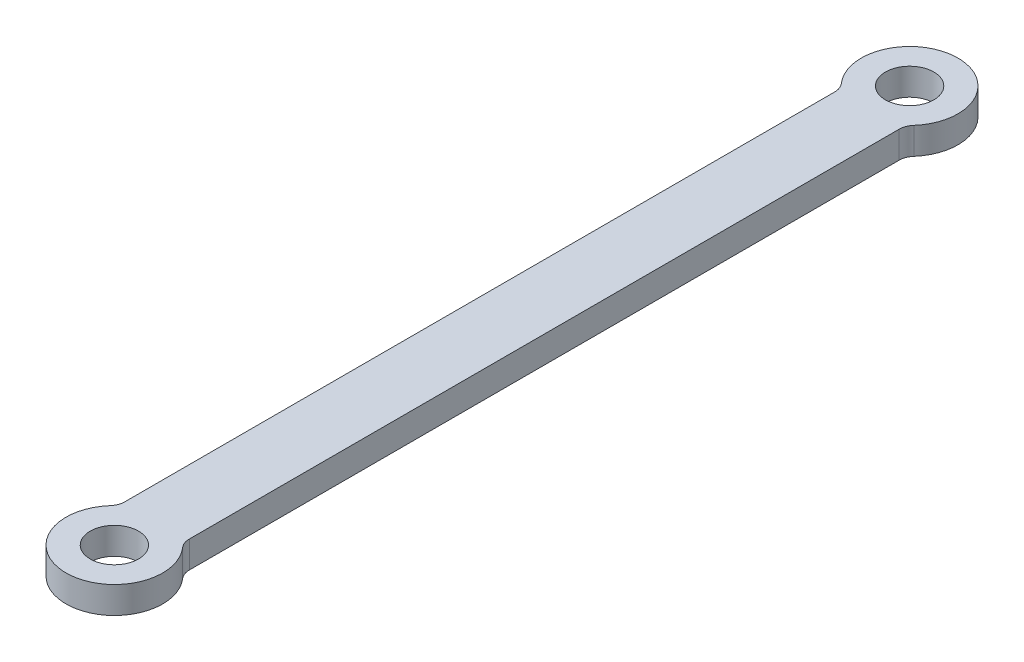
ISO-10303-21;
HEADER;
FILE_DESCRIPTION(('STEP AP214'),'2;1');
FILE_NAME('part.step','',(''),(''),'','','');
FILE_SCHEMA(('AUTOMOTIVE_DESIGN { 1 0 10303 214 1 1 1 1 }'));
ENDSEC;
DATA;
#1=APPLICATION_CONTEXT('core data for automotive mechanical design processes');
#2=APPLICATION_PROTOCOL_DEFINITION('international standard','automotive_design',2000,#1);
#3=PRODUCT_CONTEXT('',#1,'mechanical');
#4=PRODUCT('Part','Part','',(#3));
#5=PRODUCT_RELATED_PRODUCT_CATEGORY('part','',(#4));
#6=PRODUCT_DEFINITION_FORMATION('','',#4);
#7=PRODUCT_DEFINITION_CONTEXT('part definition',#1,'design');
#8=PRODUCT_DEFINITION('design','',#6,#7);
#9=PRODUCT_DEFINITION_SHAPE('','',#8);
#10=(LENGTH_UNIT() NAMED_UNIT(*) SI_UNIT(.MILLI.,.METRE.));
#11=(NAMED_UNIT(*) PLANE_ANGLE_UNIT() SI_UNIT($,.RADIAN.));
#12=(NAMED_UNIT(*) SI_UNIT($,.STERADIAN.) SOLID_ANGLE_UNIT());
#13=UNCERTAINTY_MEASURE_WITH_UNIT(LENGTH_MEASURE(1.E-05),#10,'distance_accuracy_value','');
#14=(GEOMETRIC_REPRESENTATION_CONTEXT(3) GLOBAL_UNCERTAINTY_ASSIGNED_CONTEXT((#13)) GLOBAL_UNIT_ASSIGNED_CONTEXT((#10,
#11,#12)) REPRESENTATION_CONTEXT('',''));
#15=CARTESIAN_POINT('',(0.,0.,0.));
#16=DIRECTION('',(0.,0.,1.));
#17=DIRECTION('',(1.,0.,0.));
#18=AXIS2_PLACEMENT_3D('',#15,#16,#17);
#19=CARTESIAN_POINT('',(-88.4308943089431,5.,-43.5017704570502));
#20=DIRECTION('',(0.,1.,0.));
#21=DIRECTION('',(0.,0.,1.));
#22=AXIS2_PLACEMENT_3D('',#19,#20,#21);
#23=PLANE('',#22);
#24=CARTESIAN_POINT('',(-79.4308943089431,5.,-51.4390243902439));
#25=DIRECTION('',(0.,1.,0.));
#26=DIRECTION('',(0.,0.,1.));
#27=AXIS2_PLACEMENT_3D('',#24,#25,#26);
#28=CIRCLE('',#27,4.50000000000001);
#29=CARTESIAN_POINT('',(-79.4308943089431,5.,-46.9390243902439));
#30=VERTEX_POINT('',#29);
#31=EDGE_CURVE('E146',#30,#30,#28,.T.);
#32=ORIENTED_EDGE('',*,*,#31,.F.);
#33=EDGE_LOOP('',(#32));
#34=FACE_BOUND('',#33,.T.);
#35=CARTESIAN_POINT('',(-88.4308943089431,5.,-43.5017704570502));
#36=DIRECTION('',(0.,-1.,0.));
#37=DIRECTION('',(0.,0.,1.));
#38=AXIS2_PLACEMENT_3D('',#35,#36,#37);
#39=CIRCLE('',#38,3.);
#40=CARTESIAN_POINT('',(-86.1808943089431,5.,-45.4860839403486));
#41=VERTEX_POINT('',#40);
#42=CARTESIAN_POINT('',(-85.4308943089431,5.,-43.5017704570502));
#43=VERTEX_POINT('',#42);
#44=EDGE_CURVE('E164',#41,#43,#39,.T.);
#45=ORIENTED_EDGE('',*,*,#44,.T.);
#46=DIRECTION('',(0.,0.,1.));
#47=VECTOR('',#46,1.);
#48=CARTESIAN_POINT('',(-85.4308943089431,5.,-43.5017704570502));
#49=LINE('',#48,#47);
#50=CARTESIAN_POINT('',(-85.4308943089431,5.,88.6237216765623));
#51=VERTEX_POINT('',#50);
#52=EDGE_CURVE('E100',#43,#51,#49,.T.);
#53=ORIENTED_EDGE('',*,*,#52,.T.);
#54=CARTESIAN_POINT('',(-88.4308943089431,5.,88.6237216765623));
#55=DIRECTION('',(0.,-1.,0.));
#56=DIRECTION('',(0.,0.,-1.));
#57=AXIS2_PLACEMENT_3D('',#54,#55,#56);
#58=CIRCLE('',#57,3.);
#59=CARTESIAN_POINT('',(-86.1808943089431,5.,90.6080351598608));
#60=VERTEX_POINT('',#59);
#61=EDGE_CURVE('E185',#51,#60,#58,.T.);
#62=ORIENTED_EDGE('',*,*,#61,.T.);
#63=CARTESIAN_POINT('',(-79.4308943089431,5.,96.5609756097561));
#64=DIRECTION('',(0.,1.,0.));
#65=DIRECTION('',(0.,0.,1.));
#66=AXIS2_PLACEMENT_3D('',#63,#64,#65);
#67=CIRCLE('',#66,8.99999999999999);
#68=CARTESIAN_POINT('',(-72.6808943089431,5.,90.6080351598608));
#69=VERTEX_POINT('',#68);
#70=EDGE_CURVE('E199',#60,#69,#67,.T.);
#71=ORIENTED_EDGE('',*,*,#70,.T.);
#72=CARTESIAN_POINT('',(-70.4308943089431,5.,88.6237216765623));
#73=DIRECTION('',(0.,-1.,0.));
#74=DIRECTION('',(0.,0.,1.));
#75=AXIS2_PLACEMENT_3D('',#72,#73,#74);
#76=CIRCLE('',#75,3.);
#77=CARTESIAN_POINT('',(-73.4308943089431,5.,88.6237216765623));
#78=VERTEX_POINT('',#77);
#79=EDGE_CURVE('E119',#69,#78,#76,.T.);
#80=ORIENTED_EDGE('',*,*,#79,.T.);
#81=DIRECTION('',(0.,0.,-1.));
#82=VECTOR('',#81,1.);
#83=CARTESIAN_POINT('',(-73.4308943089431,5.,88.6237216765623));
#84=LINE('',#83,#82);
#85=CARTESIAN_POINT('',(-73.4308943089431,5.,-43.5017704570502));
#86=VERTEX_POINT('',#85);
#87=EDGE_CURVE('E113',#78,#86,#84,.T.);
#88=ORIENTED_EDGE('',*,*,#87,.T.);
#89=CARTESIAN_POINT('',(-70.4308943089431,5.,-43.5017704570502));
#90=DIRECTION('',(0.,-1.,0.));
#91=DIRECTION('',(0.,0.,-1.));
#92=AXIS2_PLACEMENT_3D('',#89,#90,#91);
#93=CIRCLE('',#92,3.);
#94=CARTESIAN_POINT('',(-72.6808943089431,5.,-45.4860839403486));
#95=VERTEX_POINT('',#94);
#96=EDGE_CURVE('E117',#86,#95,#93,.T.);
#97=ORIENTED_EDGE('',*,*,#96,.T.);
#98=CARTESIAN_POINT('',(-79.4308943089431,5.,-51.4390243902439));
#99=DIRECTION('',(0.,1.,0.));
#100=DIRECTION('',(0.,0.,1.));
#101=AXIS2_PLACEMENT_3D('',#98,#99,#100);
#102=CIRCLE('',#101,9.);
#103=EDGE_CURVE('E57',#95,#41,#102,.T.);
#104=ORIENTED_EDGE('',*,*,#103,.T.);
#105=EDGE_LOOP('',(#45,#53,#62,#71,#80,#88,#97,#104));
#106=FACE_BOUND('',#105,.T.);
#107=CARTESIAN_POINT('',(-79.4308943089431,5.,96.5609756097561));
#108=DIRECTION('',(0.,1.,0.));
#109=DIRECTION('',(0.,0.,1.));
#110=AXIS2_PLACEMENT_3D('',#107,#108,#109);
#111=CIRCLE('',#110,4.50000000000001);
#112=CARTESIAN_POINT('',(-79.4308943089431,5.,101.060975609756));
#113=VERTEX_POINT('',#112);
#114=EDGE_CURVE('E213',#113,#113,#111,.T.);
#115=ORIENTED_EDGE('',*,*,#114,.F.);
#116=EDGE_LOOP('',(#115));
#117=FACE_BOUND('',#116,.T.);
#118=ADVANCED_FACE('F39',(#34,#106,#117),#23,.T.);
#119=CARTESIAN_POINT('',(-88.4308943089431,0.,-43.5017704570502));
#120=DIRECTION('',(0.,1.,0.));
#121=DIRECTION('',(0.,0.,1.));
#122=AXIS2_PLACEMENT_3D('',#119,#120,#121);
#123=PLANE('',#122);
#124=CARTESIAN_POINT('',(-88.4308943089431,0.,-43.5017704570502));
#125=DIRECTION('',(0.,-1.,0.));
#126=DIRECTION('',(0.,0.,1.));
#127=AXIS2_PLACEMENT_3D('',#124,#125,#126);
#128=CIRCLE('',#127,3.);
#129=CARTESIAN_POINT('',(-86.1808943089431,0.,-45.4860839403486));
#130=VERTEX_POINT('',#129);
#131=CARTESIAN_POINT('',(-85.4308943089431,0.,-43.5017704570502));
#132=VERTEX_POINT('',#131);
#133=EDGE_CURVE('E141',#130,#132,#128,.T.);
#134=ORIENTED_EDGE('',*,*,#133,.F.);
#135=CARTESIAN_POINT('',(-79.4308943089431,0.,-51.4390243902439));
#136=DIRECTION('',(0.,1.,0.));
#137=DIRECTION('',(0.,0.,1.));
#138=AXIS2_PLACEMENT_3D('',#135,#136,#137);
#139=CIRCLE('',#138,9.);
#140=CARTESIAN_POINT('',(-72.6808943089431,0.,-45.4860839403486));
#141=VERTEX_POINT('',#140);
#142=EDGE_CURVE('E92',#141,#130,#139,.T.);
#143=ORIENTED_EDGE('',*,*,#142,.F.);
#144=CARTESIAN_POINT('',(-70.4308943089431,0.,-43.5017704570502));
#145=DIRECTION('',(0.,-1.,0.));
#146=DIRECTION('',(0.,0.,-1.));
#147=AXIS2_PLACEMENT_3D('',#144,#145,#146);
#148=CIRCLE('',#147,3.);
#149=CARTESIAN_POINT('',(-73.4308943089431,0.,-43.5017704570502));
#150=VERTEX_POINT('',#149);
#151=EDGE_CURVE('E86',#150,#141,#148,.T.);
#152=ORIENTED_EDGE('',*,*,#151,.F.);
#153=DIRECTION('',(0.,0.,-1.));
#154=VECTOR('',#153,1.);
#155=CARTESIAN_POINT('',(-73.4308943089431,0.,88.6237216765623));
#156=LINE('',#155,#154);
#157=CARTESIAN_POINT('',(-73.4308943089431,0.,88.6237216765623));
#158=VERTEX_POINT('',#157);
#159=EDGE_CURVE('E128',#158,#150,#156,.T.);
#160=ORIENTED_EDGE('',*,*,#159,.F.);
#161=CARTESIAN_POINT('',(-70.4308943089431,0.,88.6237216765623));
#162=DIRECTION('',(0.,-1.,0.));
#163=DIRECTION('',(0.,0.,1.));
#164=AXIS2_PLACEMENT_3D('',#161,#162,#163);
#165=CIRCLE('',#164,3.);
#166=CARTESIAN_POINT('',(-72.6808943089431,0.,90.6080351598608));
#167=VERTEX_POINT('',#166);
#168=EDGE_CURVE('E155',#167,#158,#165,.T.);
#169=ORIENTED_EDGE('',*,*,#168,.F.);
#170=CARTESIAN_POINT('',(-79.4308943089431,0.,96.5609756097561));
#171=DIRECTION('',(0.,1.,0.));
#172=DIRECTION('',(0.,0.,1.));
#173=AXIS2_PLACEMENT_3D('',#170,#171,#172);
#174=CIRCLE('',#173,8.99999999999999);
#175=CARTESIAN_POINT('',(-86.1808943089431,0.,90.6080351598608));
#176=VERTEX_POINT('',#175);
#177=EDGE_CURVE('E152',#176,#167,#174,.T.);
#178=ORIENTED_EDGE('',*,*,#177,.F.);
#179=CARTESIAN_POINT('',(-88.4308943089431,0.,88.6237216765623));
#180=DIRECTION('',(0.,-1.,0.));
#181=DIRECTION('',(0.,0.,-1.));
#182=AXIS2_PLACEMENT_3D('',#179,#180,#181);
#183=CIRCLE('',#182,3.);
#184=CARTESIAN_POINT('',(-85.4308943089431,0.,88.6237216765623));
#185=VERTEX_POINT('',#184);
#186=EDGE_CURVE('E149',#185,#176,#183,.T.);
#187=ORIENTED_EDGE('',*,*,#186,.F.);
#188=DIRECTION('',(0.,0.,1.));
#189=VECTOR('',#188,1.);
#190=CARTESIAN_POINT('',(-85.4308943089431,0.,-43.5017704570502));
#191=LINE('',#190,#189);
#192=EDGE_CURVE('E145',#132,#185,#191,.T.);
#193=ORIENTED_EDGE('',*,*,#192,.F.);
#194=EDGE_LOOP('',(#134,#143,#152,#160,#169,#178,#187,#193));
#195=FACE_BOUND('',#194,.T.);
#196=CARTESIAN_POINT('',(-79.4308943089431,0.,-51.4390243902439));
#197=DIRECTION('',(0.,1.,0.));
#198=DIRECTION('',(0.,0.,1.));
#199=AXIS2_PLACEMENT_3D('',#196,#197,#198);
#200=CIRCLE('',#199,4.50000000000001);
#201=CARTESIAN_POINT('',(-79.4308943089431,0.,-46.9390243902439));
#202=VERTEX_POINT('',#201);
#203=EDGE_CURVE('E209',#202,#202,#200,.T.);
#204=ORIENTED_EDGE('',*,*,#203,.T.);
#205=EDGE_LOOP('',(#204));
#206=FACE_BOUND('',#205,.T.);
#207=CARTESIAN_POINT('',(-79.4308943089431,0.,96.5609756097561));
#208=DIRECTION('',(0.,1.,0.));
#209=DIRECTION('',(0.,0.,1.));
#210=AXIS2_PLACEMENT_3D('',#207,#208,#209);
#211=CIRCLE('',#210,4.50000000000001);
#212=CARTESIAN_POINT('',(-79.4308943089431,0.,101.060975609756));
#213=VERTEX_POINT('',#212);
#214=EDGE_CURVE('E217',#213,#213,#211,.T.);
#215=ORIENTED_EDGE('',*,*,#214,.T.);
#216=EDGE_LOOP('',(#215));
#217=FACE_BOUND('',#216,.T.);
#218=ADVANCED_FACE('F189',(#195,#206,#217),#123,.F.);
#219=CARTESIAN_POINT('',(-88.4308943089431,5.,-43.5017704570502));
#220=DIRECTION('',(0.,-1.,0.));
#221=DIRECTION('',(0.,0.,-1.));
#222=AXIS2_PLACEMENT_3D('',#219,#220,#221);
#223=CYLINDRICAL_SURFACE('',#222,3.);
#224=ORIENTED_EDGE('',*,*,#133,.T.);
#225=DIRECTION('',(0.,-1.,0.));
#226=VECTOR('',#225,1.);
#227=CARTESIAN_POINT('',(-85.4308943089431,5.,-43.5017704570502));
#228=LINE('',#227,#226);
#229=EDGE_CURVE('E11',#43,#132,#228,.T.);
#230=ORIENTED_EDGE('',*,*,#229,.F.);
#231=ORIENTED_EDGE('',*,*,#44,.F.);
#232=DIRECTION('',(0.,-1.,0.));
#233=VECTOR('',#232,1.);
#234=CARTESIAN_POINT('',(-86.1808943089431,5.,-45.4860839403486));
#235=LINE('',#234,#233);
#236=EDGE_CURVE('E137',#41,#130,#235,.T.);
#237=ORIENTED_EDGE('',*,*,#236,.T.);
#238=EDGE_LOOP('',(#224,#230,#231,#237));
#239=FACE_BOUND('',#238,.T.);
#240=ADVANCED_FACE('F41',(#239),#223,.F.);
#241=CARTESIAN_POINT('',(-85.4308943089431,5.,-43.5017704570502));
#242=DIRECTION('',(1.,0.,0.));
#243=DIRECTION('',(0.,0.,-1.));
#244=AXIS2_PLACEMENT_3D('',#241,#242,#243);
#245=PLANE('',#244);
#246=ORIENTED_EDGE('',*,*,#192,.T.);
#247=DIRECTION('',(0.,-1.,0.));
#248=VECTOR('',#247,1.);
#249=CARTESIAN_POINT('',(-85.4308943089431,5.,88.6237216765623));
#250=LINE('',#249,#248);
#251=EDGE_CURVE('E49',#51,#185,#250,.T.);
#252=ORIENTED_EDGE('',*,*,#251,.F.);
#253=ORIENTED_EDGE('',*,*,#52,.F.);
#254=ORIENTED_EDGE('',*,*,#229,.T.);
#255=EDGE_LOOP('',(#246,#252,#253,#254));
#256=FACE_BOUND('',#255,.T.);
#257=ADVANCED_FACE('F251',(#256),#245,.F.);
#258=CARTESIAN_POINT('',(-88.4308943089431,5.,88.6237216765623));
#259=DIRECTION('',(0.,-1.,0.));
#260=DIRECTION('',(0.,0.,-1.));
#261=AXIS2_PLACEMENT_3D('',#258,#259,#260);
#262=CYLINDRICAL_SURFACE('',#261,3.);
#263=ORIENTED_EDGE('',*,*,#186,.T.);
#264=DIRECTION('',(0.,-1.,0.));
#265=VECTOR('',#264,1.);
#266=CARTESIAN_POINT('',(-86.1808943089431,5.,90.6080351598608));
#267=LINE('',#266,#265);
#268=EDGE_CURVE('E175',#60,#176,#267,.T.);
#269=ORIENTED_EDGE('',*,*,#268,.F.);
#270=ORIENTED_EDGE('',*,*,#61,.F.);
#271=ORIENTED_EDGE('',*,*,#251,.T.);
#272=EDGE_LOOP('',(#263,#269,#270,#271));
#273=FACE_BOUND('',#272,.T.);
#274=ADVANCED_FACE('F183',(#273),#262,.F.);
#275=CARTESIAN_POINT('',(-79.4308943089431,5.,96.5609756097561));
#276=DIRECTION('',(0.,-1.,0.));
#277=DIRECTION('',(0.,0.,-1.));
#278=AXIS2_PLACEMENT_3D('',#275,#276,#277);
#279=CYLINDRICAL_SURFACE('',#278,8.99999999999999);
#280=ORIENTED_EDGE('',*,*,#177,.T.);
#281=DIRECTION('',(0.,-1.,0.));
#282=VECTOR('',#281,1.);
#283=CARTESIAN_POINT('',(-72.6808943089431,5.,90.6080351598608));
#284=LINE('',#283,#282);
#285=EDGE_CURVE('E171',#69,#167,#284,.T.);
#286=ORIENTED_EDGE('',*,*,#285,.F.);
#287=ORIENTED_EDGE('',*,*,#70,.F.);
#288=ORIENTED_EDGE('',*,*,#268,.T.);
#289=EDGE_LOOP('',(#280,#286,#287,#288));
#290=FACE_BOUND('',#289,.T.);
#291=ADVANCED_FACE('F194',(#290),#279,.T.);
#292=CARTESIAN_POINT('',(-70.4308943089431,5.,88.6237216765623));
#293=DIRECTION('',(0.,-1.,0.));
#294=DIRECTION('',(0.,0.,-1.));
#295=AXIS2_PLACEMENT_3D('',#292,#293,#294);
#296=CYLINDRICAL_SURFACE('',#295,3.);
#297=ORIENTED_EDGE('',*,*,#168,.T.);
#298=DIRECTION('',(0.,-1.,0.));
#299=VECTOR('',#298,1.);
#300=CARTESIAN_POINT('',(-73.4308943089431,5.,88.6237216765623));
#301=LINE('',#300,#299);
#302=EDGE_CURVE('E130',#78,#158,#301,.T.);
#303=ORIENTED_EDGE('',*,*,#302,.F.);
#304=ORIENTED_EDGE('',*,*,#79,.F.);
#305=ORIENTED_EDGE('',*,*,#285,.T.);
#306=EDGE_LOOP('',(#297,#303,#304,#305));
#307=FACE_BOUND('',#306,.T.);
#308=ADVANCED_FACE('F197',(#307),#296,.F.);
#309=CARTESIAN_POINT('',(-73.4308943089431,5.,88.6237216765623));
#310=DIRECTION('',(-1.,0.,0.));
#311=DIRECTION('',(0.,0.,1.));
#312=AXIS2_PLACEMENT_3D('',#309,#310,#311);
#313=PLANE('',#312);
#314=ORIENTED_EDGE('',*,*,#159,.T.);
#315=DIRECTION('',(0.,-1.,0.));
#316=VECTOR('',#315,1.);
#317=CARTESIAN_POINT('',(-73.4308943089431,5.,-43.5017704570502));
#318=LINE('',#317,#316);
#319=EDGE_CURVE('E125',#86,#150,#318,.T.);
#320=ORIENTED_EDGE('',*,*,#319,.F.);
#321=ORIENTED_EDGE('',*,*,#87,.F.);
#322=ORIENTED_EDGE('',*,*,#302,.T.);
#323=EDGE_LOOP('',(#314,#320,#321,#322));
#324=FACE_BOUND('',#323,.T.);
#325=ADVANCED_FACE('F126',(#324),#313,.F.);
#326=CARTESIAN_POINT('',(-70.4308943089431,5.,-43.5017704570502));
#327=DIRECTION('',(0.,-1.,0.));
#328=DIRECTION('',(0.,0.,-1.));
#329=AXIS2_PLACEMENT_3D('',#326,#327,#328);
#330=CYLINDRICAL_SURFACE('',#329,3.);
#331=ORIENTED_EDGE('',*,*,#151,.T.);
#332=DIRECTION('',(0.,-1.,0.));
#333=VECTOR('',#332,1.);
#334=CARTESIAN_POINT('',(-72.6808943089431,5.,-45.4860839403486));
#335=LINE('',#334,#333);
#336=EDGE_CURVE('E131',#95,#141,#335,.T.);
#337=ORIENTED_EDGE('',*,*,#336,.F.);
#338=ORIENTED_EDGE('',*,*,#96,.F.);
#339=ORIENTED_EDGE('',*,*,#319,.T.);
#340=EDGE_LOOP('',(#331,#337,#338,#339));
#341=FACE_BOUND('',#340,.T.);
#342=ADVANCED_FACE('F133',(#341),#330,.F.);
#343=CARTESIAN_POINT('',(-79.4308943089431,5.,-51.4390243902439));
#344=DIRECTION('',(0.,-1.,0.));
#345=DIRECTION('',(0.,0.,-1.));
#346=AXIS2_PLACEMENT_3D('',#343,#344,#345);
#347=CYLINDRICAL_SURFACE('',#346,9.);
#348=ORIENTED_EDGE('',*,*,#142,.T.);
#349=ORIENTED_EDGE('',*,*,#236,.F.);
#350=ORIENTED_EDGE('',*,*,#103,.F.);
#351=ORIENTED_EDGE('',*,*,#336,.T.);
#352=EDGE_LOOP('',(#348,#349,#350,#351));
#353=FACE_BOUND('',#352,.T.);
#354=ADVANCED_FACE('F239',(#353),#347,.T.);
#355=CARTESIAN_POINT('',(-79.4308943089431,5.,-51.4390243902439));
#356=DIRECTION('',(0.,-1.,0.));
#357=DIRECTION('',(0.,0.,-1.));
#358=AXIS2_PLACEMENT_3D('',#355,#356,#357);
#359=CYLINDRICAL_SURFACE('',#358,4.50000000000001);
#360=ORIENTED_EDGE('',*,*,#31,.T.);
#361=EDGE_LOOP('',(#360));
#362=FACE_BOUND('',#361,.T.);
#363=ORIENTED_EDGE('',*,*,#203,.F.);
#364=EDGE_LOOP('',(#363));
#365=FACE_BOUND('',#364,.T.);
#366=ADVANCED_FACE('F236',(#362,#365),#359,.F.);
#367=CARTESIAN_POINT('',(-79.4308943089431,5.,96.5609756097561));
#368=DIRECTION('',(0.,-1.,0.));
#369=DIRECTION('',(0.,0.,-1.));
#370=AXIS2_PLACEMENT_3D('',#367,#368,#369);
#371=CYLINDRICAL_SURFACE('',#370,4.50000000000001);
#372=ORIENTED_EDGE('',*,*,#114,.T.);
#373=EDGE_LOOP('',(#372));
#374=FACE_BOUND('',#373,.T.);
#375=ORIENTED_EDGE('',*,*,#214,.F.);
#376=EDGE_LOOP('',(#375));
#377=FACE_BOUND('',#376,.T.);
#378=ADVANCED_FACE('F225',(#374,#377),#371,.F.);
#379=CLOSED_SHELL('',(#118,#218,#240,#257,#274,#291,#308,#325,#342,#354,#366,#378));
#380=MANIFOLD_SOLID_BREP('B2',#379);
#381=ADVANCED_BREP_SHAPE_REPRESENTATION('',(#18,#380),#14);
#382=SHAPE_DEFINITION_REPRESENTATION(#9,#381);
ENDSEC;
END-ISO-10303-21;
